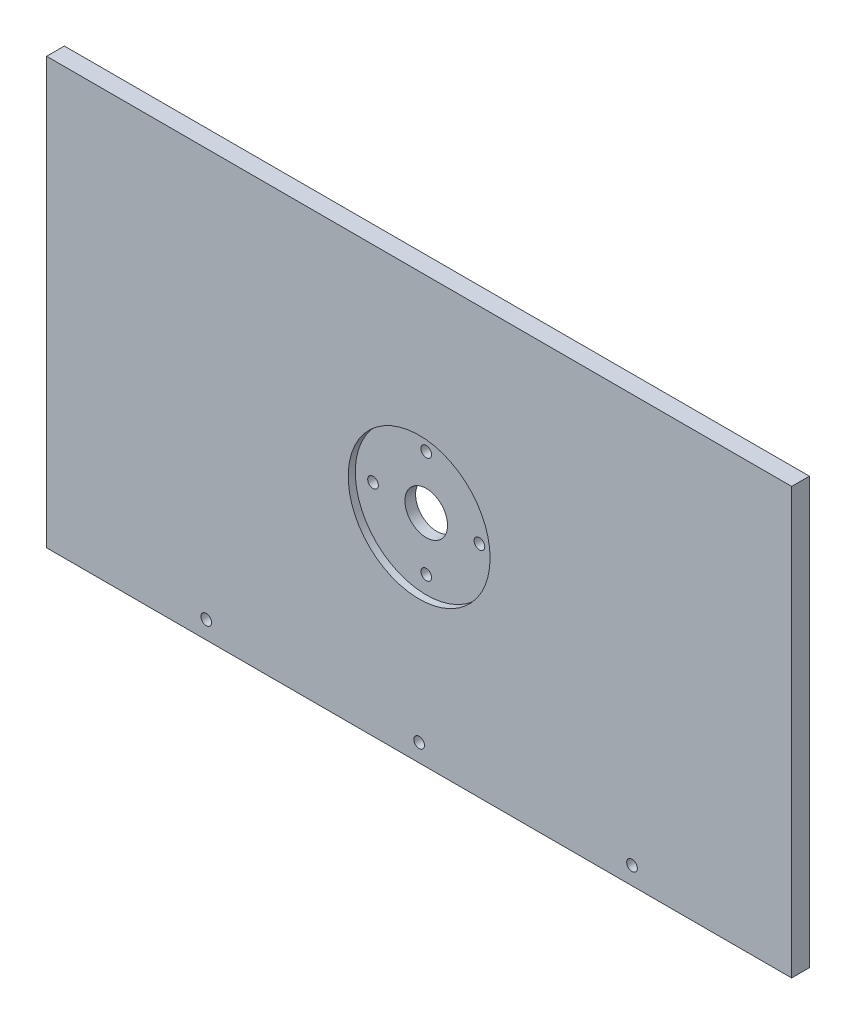
ISO-10303-21;
HEADER;
FILE_DESCRIPTION(('STEP AP214'),'2;1');
FILE_NAME('part.step','',(''),(''),'','','');
FILE_SCHEMA(('AUTOMOTIVE_DESIGN { 1 0 10303 214 1 1 1 1 }'));
ENDSEC;
DATA;
#1=APPLICATION_CONTEXT('core data for automotive mechanical design processes');
#2=APPLICATION_PROTOCOL_DEFINITION('international standard','automotive_design',2000,#1);
#3=PRODUCT_CONTEXT('',#1,'mechanical');
#4=PRODUCT('Part','Part','',(#3));
#5=PRODUCT_RELATED_PRODUCT_CATEGORY('part','',(#4));
#6=PRODUCT_DEFINITION_FORMATION('','',#4);
#7=PRODUCT_DEFINITION_CONTEXT('part definition',#1,'design');
#8=PRODUCT_DEFINITION('design','',#6,#7);
#9=PRODUCT_DEFINITION_SHAPE('','',#8);
#10=(LENGTH_UNIT() NAMED_UNIT(*) SI_UNIT(.MILLI.,.METRE.));
#11=(NAMED_UNIT(*) PLANE_ANGLE_UNIT() SI_UNIT($,.RADIAN.));
#12=(NAMED_UNIT(*) SI_UNIT($,.STERADIAN.) SOLID_ANGLE_UNIT());
#13=UNCERTAINTY_MEASURE_WITH_UNIT(LENGTH_MEASURE(1.E-05),#10,'distance_accuracy_value','');
#14=(GEOMETRIC_REPRESENTATION_CONTEXT(3) GLOBAL_UNCERTAINTY_ASSIGNED_CONTEXT((#13)) GLOBAL_UNIT_ASSIGNED_CONTEXT((#10,
#11,#12)) REPRESENTATION_CONTEXT('',''));
#15=CARTESIAN_POINT('',(0.,0.,0.));
#16=DIRECTION('',(0.,0.,1.));
#17=DIRECTION('',(1.,0.,0.));
#18=AXIS2_PLACEMENT_3D('',#15,#16,#17);
#19=CARTESIAN_POINT('',(0.,-120.,5.));
#20=DIRECTION('',(1.,0.,0.));
#21=DIRECTION('',(0.,0.,-1.));
#22=AXIS2_PLACEMENT_3D('',#19,#20,#21);
#23=PLANE('',#22);
#24=DIRECTION('',(0.,-1.,0.));
#25=VECTOR('',#24,1.);
#26=CARTESIAN_POINT('',(0.,-120.,0.));
#27=LINE('',#26,#25);
#28=CARTESIAN_POINT('',(0.,0.,0.));
#29=VERTEX_POINT('',#28);
#30=CARTESIAN_POINT('',(0.,-120.,0.));
#31=VERTEX_POINT('',#30);
#32=EDGE_CURVE('E109',#29,#31,#27,.T.);
#33=ORIENTED_EDGE('',*,*,#32,.T.);
#34=DIRECTION('',(0.,0.,-1.));
#35=VECTOR('',#34,1.);
#36=CARTESIAN_POINT('',(0.,-120.,5.));
#37=LINE('',#36,#35);
#38=CARTESIAN_POINT('',(0.,-120.,5.));
#39=VERTEX_POINT('',#38);
#40=EDGE_CURVE('E11',#39,#31,#37,.T.);
#41=ORIENTED_EDGE('',*,*,#40,.F.);
#42=DIRECTION('',(0.,-1.,0.));
#43=VECTOR('',#42,1.);
#44=CARTESIAN_POINT('',(0.,-120.,5.));
#45=LINE('',#44,#43);
#46=CARTESIAN_POINT('',(0.,0.,5.));
#47=VERTEX_POINT('',#46);
#48=EDGE_CURVE('E92',#47,#39,#45,.T.);
#49=ORIENTED_EDGE('',*,*,#48,.F.);
#50=DIRECTION('',(0.,0.,-1.));
#51=VECTOR('',#50,1.);
#52=CARTESIAN_POINT('',(0.,0.,5.));
#53=LINE('',#52,#51);
#54=EDGE_CURVE('E105',#47,#29,#53,.T.);
#55=ORIENTED_EDGE('',*,*,#54,.T.);
#56=EDGE_LOOP('',(#33,#41,#49,#55));
#57=FACE_BOUND('',#56,.T.);
#58=ADVANCED_FACE('F38',(#57),#23,.F.);
#59=CARTESIAN_POINT('',(210.,-120.,5.));
#60=DIRECTION('',(0.,1.,0.));
#61=DIRECTION('',(0.,0.,1.));
#62=AXIS2_PLACEMENT_3D('',#59,#60,#61);
#63=PLANE('',#62);
#64=DIRECTION('',(1.,0.,0.));
#65=VECTOR('',#64,1.);
#66=CARTESIAN_POINT('',(210.,-120.,0.));
#67=LINE('',#66,#65);
#68=CARTESIAN_POINT('',(210.,-120.,0.));
#69=VERTEX_POINT('',#68);
#70=EDGE_CURVE('E97',#31,#69,#67,.T.);
#71=ORIENTED_EDGE('',*,*,#70,.T.);
#72=DIRECTION('',(0.,0.,-1.));
#73=VECTOR('',#72,1.);
#74=CARTESIAN_POINT('',(210.,-120.,5.));
#75=LINE('',#74,#73);
#76=CARTESIAN_POINT('',(210.,-120.,5.));
#77=VERTEX_POINT('',#76);
#78=EDGE_CURVE('E48',#77,#69,#75,.T.);
#79=ORIENTED_EDGE('',*,*,#78,.F.);
#80=DIRECTION('',(1.,0.,0.));
#81=VECTOR('',#80,1.);
#82=CARTESIAN_POINT('',(210.,-120.,5.));
#83=LINE('',#82,#81);
#84=EDGE_CURVE('E87',#39,#77,#83,.T.);
#85=ORIENTED_EDGE('',*,*,#84,.F.);
#86=ORIENTED_EDGE('',*,*,#40,.T.);
#87=EDGE_LOOP('',(#71,#79,#85,#86));
#88=FACE_BOUND('',#87,.T.);
#89=ADVANCED_FACE('F96',(#88),#63,.F.);
#90=CARTESIAN_POINT('',(210.,0.,5.));
#91=DIRECTION('',(-1.,0.,0.));
#92=DIRECTION('',(0.,-1.,0.));
#93=AXIS2_PLACEMENT_3D('',#90,#91,#92);
#94=PLANE('',#93);
#95=DIRECTION('',(0.,1.,0.));
#96=VECTOR('',#95,1.);
#97=CARTESIAN_POINT('',(210.,0.,0.));
#98=LINE('',#97,#96);
#99=CARTESIAN_POINT('',(210.,0.,0.));
#100=VERTEX_POINT('',#99);
#101=EDGE_CURVE('E74',#69,#100,#98,.T.);
#102=ORIENTED_EDGE('',*,*,#101,.T.);
#103=DIRECTION('',(0.,0.,-1.));
#104=VECTOR('',#103,1.);
#105=CARTESIAN_POINT('',(210.,0.,5.));
#106=LINE('',#105,#104);
#107=CARTESIAN_POINT('',(210.,0.,5.));
#108=VERTEX_POINT('',#107);
#109=EDGE_CURVE('E99',#108,#100,#106,.T.);
#110=ORIENTED_EDGE('',*,*,#109,.F.);
#111=DIRECTION('',(0.,1.,0.));
#112=VECTOR('',#111,1.);
#113=CARTESIAN_POINT('',(210.,0.,5.));
#114=LINE('',#113,#112);
#115=EDGE_CURVE('E90',#77,#108,#114,.T.);
#116=ORIENTED_EDGE('',*,*,#115,.F.);
#117=ORIENTED_EDGE('',*,*,#78,.T.);
#118=EDGE_LOOP('',(#102,#110,#116,#117));
#119=FACE_BOUND('',#118,.T.);
#120=ADVANCED_FACE('F101',(#119),#94,.F.);
#121=CARTESIAN_POINT('',(0.,0.,5.));
#122=DIRECTION('',(0.,-1.,0.));
#123=DIRECTION('',(0.,0.,-1.));
#124=AXIS2_PLACEMENT_3D('',#121,#122,#123);
#125=PLANE('',#124);
#126=DIRECTION('',(-1.,0.,0.));
#127=VECTOR('',#126,1.);
#128=CARTESIAN_POINT('',(0.,0.,0.));
#129=LINE('',#128,#127);
#130=EDGE_CURVE('E80',#100,#29,#129,.T.);
#131=ORIENTED_EDGE('',*,*,#130,.T.);
#132=ORIENTED_EDGE('',*,*,#54,.F.);
#133=DIRECTION('',(-1.,0.,0.));
#134=VECTOR('',#133,1.);
#135=CARTESIAN_POINT('',(0.,0.,5.));
#136=LINE('',#135,#134);
#137=EDGE_CURVE('E57',#108,#47,#136,.T.);
#138=ORIENTED_EDGE('',*,*,#137,.F.);
#139=ORIENTED_EDGE('',*,*,#109,.T.);
#140=EDGE_LOOP('',(#131,#132,#138,#139));
#141=FACE_BOUND('',#140,.T.);
#142=ADVANCED_FACE('F196',(#141),#125,.F.);
#143=CARTESIAN_POINT('',(0.,0.,5.));
#144=DIRECTION('',(0.,0.,-1.));
#145=DIRECTION('',(-1.,0.,0.));
#146=AXIS2_PLACEMENT_3D('',#143,#144,#145);
#147=PLANE('',#146);
#148=CARTESIAN_POINT('',(45.,-115.,5.));
#149=DIRECTION('',(0.,0.,1.));
#150=DIRECTION('',(1.,0.,0.));
#151=AXIS2_PLACEMENT_3D('',#148,#149,#150);
#152=CIRCLE('',#151,1.5);
#153=CARTESIAN_POINT('',(46.5,-115.,5.));
#154=VERTEX_POINT('',#153);
#155=EDGE_CURVE('E128',#154,#154,#152,.T.);
#156=ORIENTED_EDGE('',*,*,#155,.F.);
#157=EDGE_LOOP('',(#156));
#158=FACE_BOUND('',#157,.T.);
#159=CARTESIAN_POINT('',(105.,-115.,5.));
#160=DIRECTION('',(0.,0.,1.));
#161=DIRECTION('',(1.,0.,0.));
#162=AXIS2_PLACEMENT_3D('',#159,#160,#161);
#163=CIRCLE('',#162,1.5);
#164=CARTESIAN_POINT('',(106.5,-115.,5.));
#165=VERTEX_POINT('',#164);
#166=EDGE_CURVE('E340',#165,#165,#163,.T.);
#167=ORIENTED_EDGE('',*,*,#166,.F.);
#168=EDGE_LOOP('',(#167));
#169=FACE_BOUND('',#168,.T.);
#170=CARTESIAN_POINT('',(165.,-115.,5.));
#171=DIRECTION('',(0.,0.,1.));
#172=DIRECTION('',(1.,0.,0.));
#173=AXIS2_PLACEMENT_3D('',#170,#171,#172);
#174=CIRCLE('',#173,1.5);
#175=CARTESIAN_POINT('',(166.5,-115.,5.));
#176=VERTEX_POINT('',#175);
#177=EDGE_CURVE('E149',#176,#176,#174,.T.);
#178=ORIENTED_EDGE('',*,*,#177,.F.);
#179=EDGE_LOOP('',(#178));
#180=FACE_BOUND('',#179,.T.);
#181=CARTESIAN_POINT('',(105.,-60.,5.));
#182=DIRECTION('',(0.,0.,1.));
#183=DIRECTION('',(1.,0.,0.));
#184=AXIS2_PLACEMENT_3D('',#181,#182,#183);
#185=CIRCLE('',#184,20.);
#186=CARTESIAN_POINT('',(125.,-60.,5.));
#187=VERTEX_POINT('',#186);
#188=EDGE_CURVE('E183',#187,#187,#185,.T.);
#189=ORIENTED_EDGE('',*,*,#188,.F.);
#190=EDGE_LOOP('',(#189));
#191=FACE_BOUND('',#190,.T.);
#192=ORIENTED_EDGE('',*,*,#48,.T.);
#193=ORIENTED_EDGE('',*,*,#84,.T.);
#194=ORIENTED_EDGE('',*,*,#115,.T.);
#195=ORIENTED_EDGE('',*,*,#137,.T.);
#196=EDGE_LOOP('',(#192,#193,#194,#195));
#197=FACE_BOUND('',#196,.T.);
#198=ADVANCED_FACE('F88',(#158,#169,#180,#191,#197),#147,.F.);
#199=CARTESIAN_POINT('',(0.,0.,0.));
#200=DIRECTION('',(0.,0.,-1.));
#201=DIRECTION('',(-1.,0.,0.));
#202=AXIS2_PLACEMENT_3D('',#199,#200,#201);
#203=PLANE('',#202);
#204=CARTESIAN_POINT('',(45.,-115.,0.));
#205=DIRECTION('',(0.,0.,-1.));
#206=DIRECTION('',(-1.,0.,0.));
#207=AXIS2_PLACEMENT_3D('',#204,#205,#206);
#208=CIRCLE('',#207,1.5);
#209=CARTESIAN_POINT('',(43.5,-115.,0.));
#210=VERTEX_POINT('',#209);
#211=EDGE_CURVE('E41',#210,#210,#208,.T.);
#212=ORIENTED_EDGE('',*,*,#211,.F.);
#213=EDGE_LOOP('',(#212));
#214=FACE_BOUND('',#213,.T.);
#215=CARTESIAN_POINT('',(105.,-115.,0.));
#216=DIRECTION('',(0.,0.,-1.));
#217=DIRECTION('',(-1.,0.,0.));
#218=AXIS2_PLACEMENT_3D('',#215,#216,#217);
#219=CIRCLE('',#218,1.5);
#220=CARTESIAN_POINT('',(103.5,-115.,0.));
#221=VERTEX_POINT('',#220);
#222=EDGE_CURVE('E127',#221,#221,#219,.T.);
#223=ORIENTED_EDGE('',*,*,#222,.F.);
#224=EDGE_LOOP('',(#223));
#225=FACE_BOUND('',#224,.T.);
#226=CARTESIAN_POINT('',(165.,-115.,0.));
#227=DIRECTION('',(0.,0.,-1.));
#228=DIRECTION('',(-1.,0.,0.));
#229=AXIS2_PLACEMENT_3D('',#226,#227,#228);
#230=CIRCLE('',#229,1.5);
#231=CARTESIAN_POINT('',(163.5,-115.,0.));
#232=VERTEX_POINT('',#231);
#233=EDGE_CURVE('E124',#232,#232,#230,.T.);
#234=ORIENTED_EDGE('',*,*,#233,.F.);
#235=EDGE_LOOP('',(#234));
#236=FACE_BOUND('',#235,.T.);
#237=CARTESIAN_POINT('',(105.,-60.,0.));
#238=DIRECTION('',(0.,0.,-1.));
#239=DIRECTION('',(-1.,0.,0.));
#240=AXIS2_PLACEMENT_3D('',#237,#238,#239);
#241=CIRCLE('',#240,6.);
#242=CARTESIAN_POINT('',(99.,-60.,0.));
#243=VERTEX_POINT('',#242);
#244=EDGE_CURVE('E140',#243,#243,#241,.T.);
#245=ORIENTED_EDGE('',*,*,#244,.F.);
#246=EDGE_LOOP('',(#245));
#247=FACE_BOUND('',#246,.T.);
#248=CARTESIAN_POINT('',(90.,-60.,0.));
#249=DIRECTION('',(0.,0.,-1.));
#250=DIRECTION('',(-1.,0.,0.));
#251=AXIS2_PLACEMENT_3D('',#248,#249,#250);
#252=CIRCLE('',#251,1.5);
#253=CARTESIAN_POINT('',(88.5,-60.,0.));
#254=VERTEX_POINT('',#253);
#255=EDGE_CURVE('E179',#254,#254,#252,.T.);
#256=ORIENTED_EDGE('',*,*,#255,.F.);
#257=EDGE_LOOP('',(#256));
#258=FACE_BOUND('',#257,.T.);
#259=CARTESIAN_POINT('',(105.,-45.,0.));
#260=DIRECTION('',(0.,0.,-1.));
#261=DIRECTION('',(-1.,0.,0.));
#262=AXIS2_PLACEMENT_3D('',#259,#260,#261);
#263=CIRCLE('',#262,1.5);
#264=CARTESIAN_POINT('',(103.5,-45.,0.));
#265=VERTEX_POINT('',#264);
#266=EDGE_CURVE('E175',#265,#265,#263,.T.);
#267=ORIENTED_EDGE('',*,*,#266,.F.);
#268=EDGE_LOOP('',(#267));
#269=FACE_BOUND('',#268,.T.);
#270=CARTESIAN_POINT('',(120.,-60.,0.));
#271=DIRECTION('',(0.,0.,-1.));
#272=DIRECTION('',(-1.,0.,0.));
#273=AXIS2_PLACEMENT_3D('',#270,#271,#272);
#274=CIRCLE('',#273,1.5);
#275=CARTESIAN_POINT('',(118.5,-60.,0.));
#276=VERTEX_POINT('',#275);
#277=EDGE_CURVE('E171',#276,#276,#274,.T.);
#278=ORIENTED_EDGE('',*,*,#277,.F.);
#279=EDGE_LOOP('',(#278));
#280=FACE_BOUND('',#279,.T.);
#281=CARTESIAN_POINT('',(105.,-75.,0.));
#282=DIRECTION('',(0.,0.,-1.));
#283=DIRECTION('',(-1.,0.,0.));
#284=AXIS2_PLACEMENT_3D('',#281,#282,#283);
#285=CIRCLE('',#284,1.5);
#286=CARTESIAN_POINT('',(103.5,-75.,0.));
#287=VERTEX_POINT('',#286);
#288=EDGE_CURVE('E156',#287,#287,#285,.T.);
#289=ORIENTED_EDGE('',*,*,#288,.F.);
#290=EDGE_LOOP('',(#289));
#291=FACE_BOUND('',#290,.T.);
#292=ORIENTED_EDGE('',*,*,#32,.F.);
#293=ORIENTED_EDGE('',*,*,#130,.F.);
#294=ORIENTED_EDGE('',*,*,#101,.F.);
#295=ORIENTED_EDGE('',*,*,#70,.F.);
#296=EDGE_LOOP('',(#292,#293,#294,#295));
#297=FACE_BOUND('',#296,.T.);
#298=ADVANCED_FACE('F195',(#214,#225,#236,#247,#258,#269,#280,#291,#297),#203,.T.);
#299=CARTESIAN_POINT('',(105.,-60.,3.));
#300=DIRECTION('',(0.,0.,1.));
#301=DIRECTION('',(1.,0.,0.));
#302=AXIS2_PLACEMENT_3D('',#299,#300,#301);
#303=CYLINDRICAL_SURFACE('',#302,20.);
#304=CARTESIAN_POINT('',(105.,-60.,3.));
#305=DIRECTION('',(0.,0.,1.));
#306=DIRECTION('',(1.,0.,0.));
#307=AXIS2_PLACEMENT_3D('',#304,#305,#306);
#308=CIRCLE('',#307,20.);
#309=CARTESIAN_POINT('',(125.,-60.,3.));
#310=VERTEX_POINT('',#309);
#311=EDGE_CURVE('E113',#310,#310,#308,.T.);
#312=ORIENTED_EDGE('',*,*,#311,.F.);
#313=EDGE_LOOP('',(#312));
#314=FACE_BOUND('',#313,.T.);
#315=ORIENTED_EDGE('',*,*,#188,.T.);
#316=EDGE_LOOP('',(#315));
#317=FACE_BOUND('',#316,.T.);
#318=ADVANCED_FACE('F192',(#314,#317),#303,.F.);
#319=CARTESIAN_POINT('',(0.,0.,3.));
#320=DIRECTION('',(0.,0.,1.));
#321=DIRECTION('',(1.,0.,0.));
#322=AXIS2_PLACEMENT_3D('',#319,#320,#321);
#323=PLANE('',#322);
#324=CARTESIAN_POINT('',(105.,-60.,3.));
#325=DIRECTION('',(0.,0.,1.));
#326=DIRECTION('',(1.,0.,0.));
#327=AXIS2_PLACEMENT_3D('',#324,#325,#326);
#328=CIRCLE('',#327,6.);
#329=CARTESIAN_POINT('',(111.,-60.,3.));
#330=VERTEX_POINT('',#329);
#331=EDGE_CURVE('E135',#330,#330,#328,.T.);
#332=ORIENTED_EDGE('',*,*,#331,.F.);
#333=EDGE_LOOP('',(#332));
#334=FACE_BOUND('',#333,.T.);
#335=CARTESIAN_POINT('',(90.,-60.,3.));
#336=DIRECTION('',(0.,0.,1.));
#337=DIRECTION('',(1.,0.,0.));
#338=AXIS2_PLACEMENT_3D('',#335,#336,#337);
#339=CIRCLE('',#338,1.5);
#340=CARTESIAN_POINT('',(91.5,-60.,3.));
#341=VERTEX_POINT('',#340);
#342=EDGE_CURVE('E152',#341,#341,#339,.T.);
#343=ORIENTED_EDGE('',*,*,#342,.F.);
#344=EDGE_LOOP('',(#343));
#345=FACE_BOUND('',#344,.T.);
#346=CARTESIAN_POINT('',(105.,-45.,3.));
#347=DIRECTION('',(0.,0.,1.));
#348=DIRECTION('',(1.,0.,0.));
#349=AXIS2_PLACEMENT_3D('',#346,#347,#348);
#350=CIRCLE('',#349,1.5);
#351=CARTESIAN_POINT('',(106.5,-45.,3.));
#352=VERTEX_POINT('',#351);
#353=EDGE_CURVE('E157',#352,#352,#350,.T.);
#354=ORIENTED_EDGE('',*,*,#353,.F.);
#355=EDGE_LOOP('',(#354));
#356=FACE_BOUND('',#355,.T.);
#357=CARTESIAN_POINT('',(120.,-60.,3.));
#358=DIRECTION('',(0.,0.,1.));
#359=DIRECTION('',(1.,0.,0.));
#360=AXIS2_PLACEMENT_3D('',#357,#358,#359);
#361=CIRCLE('',#360,1.5);
#362=CARTESIAN_POINT('',(121.5,-60.,3.));
#363=VERTEX_POINT('',#362);
#364=EDGE_CURVE('E161',#363,#363,#361,.T.);
#365=ORIENTED_EDGE('',*,*,#364,.F.);
#366=EDGE_LOOP('',(#365));
#367=FACE_BOUND('',#366,.T.);
#368=CARTESIAN_POINT('',(105.,-75.,3.));
#369=DIRECTION('',(0.,0.,1.));
#370=DIRECTION('',(1.,0.,0.));
#371=AXIS2_PLACEMENT_3D('',#368,#369,#370);
#372=CIRCLE('',#371,1.5);
#373=CARTESIAN_POINT('',(106.5,-75.,3.));
#374=VERTEX_POINT('',#373);
#375=EDGE_CURVE('E146',#374,#374,#372,.T.);
#376=ORIENTED_EDGE('',*,*,#375,.F.);
#377=EDGE_LOOP('',(#376));
#378=FACE_BOUND('',#377,.T.);
#379=ORIENTED_EDGE('',*,*,#311,.T.);
#380=EDGE_LOOP('',(#379));
#381=FACE_BOUND('',#380,.T.);
#382=ADVANCED_FACE('F236',(#334,#345,#356,#367,#378,#381),#323,.T.);
#383=CARTESIAN_POINT('',(105.,-75.,-2.));
#384=DIRECTION('',(0.,0.,1.));
#385=DIRECTION('',(1.,0.,0.));
#386=AXIS2_PLACEMENT_3D('',#383,#384,#385);
#387=CYLINDRICAL_SURFACE('',#386,1.5);
#388=ORIENTED_EDGE('',*,*,#288,.T.);
#389=EDGE_LOOP('',(#388));
#390=FACE_BOUND('',#389,.T.);
#391=ORIENTED_EDGE('',*,*,#375,.T.);
#392=EDGE_LOOP('',(#391));
#393=FACE_BOUND('',#392,.T.);
#394=ADVANCED_FACE('F244',(#390,#393),#387,.F.);
#395=CARTESIAN_POINT('',(120.,-60.,-2.));
#396=DIRECTION('',(0.,0.,1.));
#397=DIRECTION('',(1.,0.,0.));
#398=AXIS2_PLACEMENT_3D('',#395,#396,#397);
#399=CYLINDRICAL_SURFACE('',#398,1.5);
#400=ORIENTED_EDGE('',*,*,#277,.T.);
#401=EDGE_LOOP('',(#400));
#402=FACE_BOUND('',#401,.T.);
#403=ORIENTED_EDGE('',*,*,#364,.T.);
#404=EDGE_LOOP('',(#403));
#405=FACE_BOUND('',#404,.T.);
#406=ADVANCED_FACE('F249',(#402,#405),#399,.F.);
#407=CARTESIAN_POINT('',(105.,-45.,-2.));
#408=DIRECTION('',(0.,0.,1.));
#409=DIRECTION('',(1.,0.,0.));
#410=AXIS2_PLACEMENT_3D('',#407,#408,#409);
#411=CYLINDRICAL_SURFACE('',#410,1.5);
#412=ORIENTED_EDGE('',*,*,#266,.T.);
#413=EDGE_LOOP('',(#412));
#414=FACE_BOUND('',#413,.T.);
#415=ORIENTED_EDGE('',*,*,#353,.T.);
#416=EDGE_LOOP('',(#415));
#417=FACE_BOUND('',#416,.T.);
#418=ADVANCED_FACE('F260',(#414,#417),#411,.F.);
#419=CARTESIAN_POINT('',(90.,-60.,-2.));
#420=DIRECTION('',(0.,0.,1.));
#421=DIRECTION('',(1.,0.,0.));
#422=AXIS2_PLACEMENT_3D('',#419,#420,#421);
#423=CYLINDRICAL_SURFACE('',#422,1.5);
#424=ORIENTED_EDGE('',*,*,#255,.T.);
#425=EDGE_LOOP('',(#424));
#426=FACE_BOUND('',#425,.T.);
#427=ORIENTED_EDGE('',*,*,#342,.T.);
#428=EDGE_LOOP('',(#427));
#429=FACE_BOUND('',#428,.T.);
#430=ADVANCED_FACE('F270',(#426,#429),#423,.F.);
#431=CARTESIAN_POINT('',(105.,-60.,-2.));
#432=DIRECTION('',(0.,0.,1.));
#433=DIRECTION('',(1.,0.,0.));
#434=AXIS2_PLACEMENT_3D('',#431,#432,#433);
#435=CYLINDRICAL_SURFACE('',#434,6.);
#436=ORIENTED_EDGE('',*,*,#244,.T.);
#437=EDGE_LOOP('',(#436));
#438=FACE_BOUND('',#437,.T.);
#439=ORIENTED_EDGE('',*,*,#331,.T.);
#440=EDGE_LOOP('',(#439));
#441=FACE_BOUND('',#440,.T.);
#442=ADVANCED_FACE('F280',(#438,#441),#435,.F.);
#443=CARTESIAN_POINT('',(165.,-115.,-5.));
#444=DIRECTION('',(0.,0.,1.));
#445=DIRECTION('',(1.,0.,0.));
#446=AXIS2_PLACEMENT_3D('',#443,#444,#445);
#447=CYLINDRICAL_SURFACE('',#446,1.5);
#448=ORIENTED_EDGE('',*,*,#233,.T.);
#449=EDGE_LOOP('',(#448));
#450=FACE_BOUND('',#449,.T.);
#451=ORIENTED_EDGE('',*,*,#177,.T.);
#452=EDGE_LOOP('',(#451));
#453=FACE_BOUND('',#452,.T.);
#454=ADVANCED_FACE('F296',(#450,#453),#447,.F.);
#455=CARTESIAN_POINT('',(105.,-115.,-5.));
#456=DIRECTION('',(0.,0.,1.));
#457=DIRECTION('',(1.,0.,0.));
#458=AXIS2_PLACEMENT_3D('',#455,#456,#457);
#459=CYLINDRICAL_SURFACE('',#458,1.5);
#460=ORIENTED_EDGE('',*,*,#222,.T.);
#461=EDGE_LOOP('',(#460));
#462=FACE_BOUND('',#461,.T.);
#463=ORIENTED_EDGE('',*,*,#166,.T.);
#464=EDGE_LOOP('',(#463));
#465=FACE_BOUND('',#464,.T.);
#466=ADVANCED_FACE('F315',(#462,#465),#459,.F.);
#467=CARTESIAN_POINT('',(45.,-115.,-5.));
#468=DIRECTION('',(0.,0.,1.));
#469=DIRECTION('',(1.,0.,0.));
#470=AXIS2_PLACEMENT_3D('',#467,#468,#469);
#471=CYLINDRICAL_SURFACE('',#470,1.5);
#472=ORIENTED_EDGE('',*,*,#211,.T.);
#473=EDGE_LOOP('',(#472));
#474=FACE_BOUND('',#473,.T.);
#475=ORIENTED_EDGE('',*,*,#155,.T.);
#476=EDGE_LOOP('',(#475));
#477=FACE_BOUND('',#476,.T.);
#478=ADVANCED_FACE('F325',(#474,#477),#471,.F.);
#479=CLOSED_SHELL('',(#58,#89,#120,#142,#198,#298,#318,#382,#394,#406,#418,#430,#442,#454,#466,#478));
#480=MANIFOLD_SOLID_BREP('B2',#479);
#481=ADVANCED_BREP_SHAPE_REPRESENTATION('',(#18,#480),#14);
#482=SHAPE_DEFINITION_REPRESENTATION(#9,#481);
ENDSEC;
END-ISO-10303-21;
